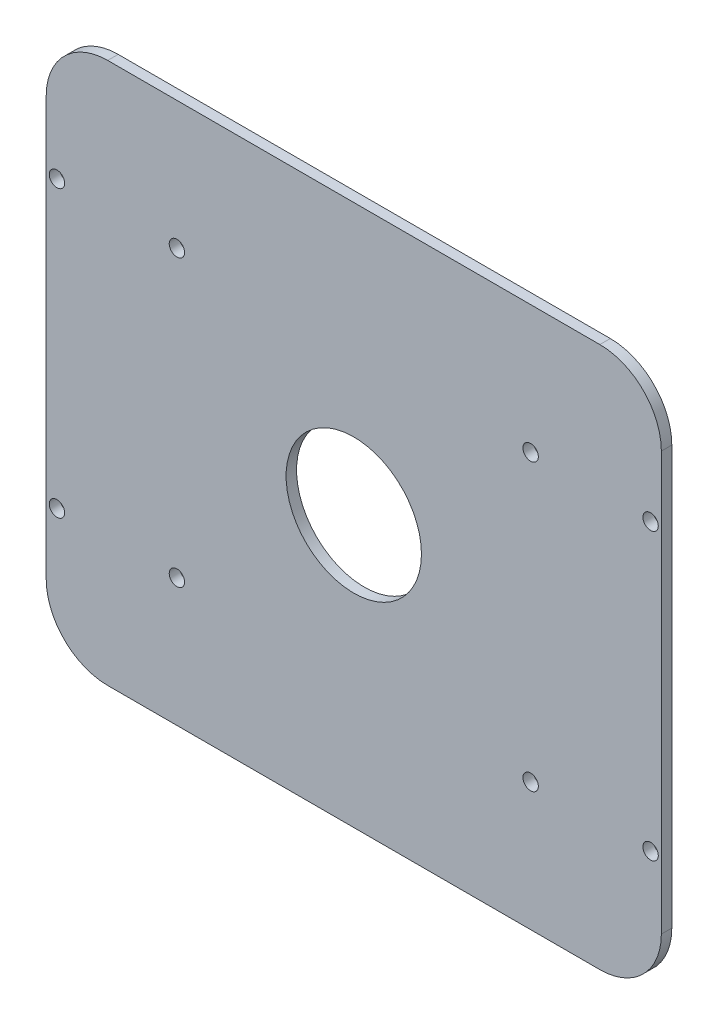
ISO-10303-21;
HEADER;
FILE_DESCRIPTION(('STEP AP214'),'2;1');
FILE_NAME('part.step','',(''),(''),'','','');
FILE_SCHEMA(('AUTOMOTIVE_DESIGN { 1 0 10303 214 1 1 1 1 }'));
ENDSEC;
DATA;
#1=APPLICATION_CONTEXT('core data for automotive mechanical design processes');
#2=APPLICATION_PROTOCOL_DEFINITION('international standard','automotive_design',2000,#1);
#3=PRODUCT_CONTEXT('',#1,'mechanical');
#4=PRODUCT('Part','Part','',(#3));
#5=PRODUCT_RELATED_PRODUCT_CATEGORY('part','',(#4));
#6=PRODUCT_DEFINITION_FORMATION('','',#4);
#7=PRODUCT_DEFINITION_CONTEXT('part definition',#1,'design');
#8=PRODUCT_DEFINITION('design','',#6,#7);
#9=PRODUCT_DEFINITION_SHAPE('','',#8);
#10=(LENGTH_UNIT() NAMED_UNIT(*) SI_UNIT(.MILLI.,.METRE.));
#11=(NAMED_UNIT(*) PLANE_ANGLE_UNIT() SI_UNIT($,.RADIAN.));
#12=(NAMED_UNIT(*) SI_UNIT($,.STERADIAN.) SOLID_ANGLE_UNIT());
#13=UNCERTAINTY_MEASURE_WITH_UNIT(LENGTH_MEASURE(1.E-05),#10,'distance_accuracy_value','');
#14=(GEOMETRIC_REPRESENTATION_CONTEXT(3) GLOBAL_UNCERTAINTY_ASSIGNED_CONTEXT((#13)) GLOBAL_UNIT_ASSIGNED_CONTEXT((#10,
#11,#12)) REPRESENTATION_CONTEXT('',''));
#15=CARTESIAN_POINT('',(0.,0.,0.));
#16=DIRECTION('',(0.,0.,1.));
#17=DIRECTION('',(1.,0.,0.));
#18=AXIS2_PLACEMENT_3D('',#15,#16,#17);
#19=CARTESIAN_POINT('',(0.,0.,1.7));
#20=DIRECTION('',(0.,0.,1.));
#21=DIRECTION('',(1.,0.,0.));
#22=AXIS2_PLACEMENT_3D('',#19,#20,#21);
#23=PLANE('',#22);
#24=CARTESIAN_POINT('',(28.75,-23.2,1.7));
#25=DIRECTION('',(0.,0.,1.));
#26=DIRECTION('',(1.,0.,0.));
#27=AXIS2_PLACEMENT_3D('',#24,#25,#26);
#28=CIRCLE('',#27,1.25);
#29=CARTESIAN_POINT('',(30.,-23.2,1.7));
#30=VERTEX_POINT('',#29);
#31=EDGE_CURVE('E280',#30,#30,#28,.T.);
#32=ORIENTED_EDGE('',*,*,#31,.F.);
#33=EDGE_LOOP('',(#32));
#34=FACE_BOUND('',#33,.T.);
#35=CARTESIAN_POINT('',(0.,0.,1.7));
#36=DIRECTION('',(0.,0.,1.));
#37=DIRECTION('',(1.,0.,0.));
#38=AXIS2_PLACEMENT_3D('',#35,#36,#37);
#39=CIRCLE('',#38,11.);
#40=CARTESIAN_POINT('',(11.,0.,1.7));
#41=VERTEX_POINT('',#40);
#42=EDGE_CURVE('E296',#41,#41,#39,.T.);
#43=ORIENTED_EDGE('',*,*,#42,.F.);
#44=EDGE_LOOP('',(#43));
#45=FACE_BOUND('',#44,.T.);
#46=CARTESIAN_POINT('',(48.25,-23.2,1.7));
#47=DIRECTION('',(0.,0.,1.));
#48=DIRECTION('',(-1.,0.,0.));
#49=AXIS2_PLACEMENT_3D('',#46,#47,#48);
#50=CIRCLE('',#49,1.25);
#51=CARTESIAN_POINT('',(47.,-23.2,1.7));
#52=VERTEX_POINT('',#51);
#53=EDGE_CURVE('E312',#52,#52,#50,.T.);
#54=ORIENTED_EDGE('',*,*,#53,.F.);
#55=EDGE_LOOP('',(#54));
#56=FACE_BOUND('',#55,.T.);
#57=CARTESIAN_POINT('',(-48.25,-23.2,1.7));
#58=DIRECTION('',(0.,0.,1.));
#59=DIRECTION('',(1.,0.,0.));
#60=AXIS2_PLACEMENT_3D('',#57,#58,#59);
#61=CIRCLE('',#60,1.25);
#62=CARTESIAN_POINT('',(-47.,-23.2,1.7));
#63=VERTEX_POINT('',#62);
#64=EDGE_CURVE('E328',#63,#63,#61,.T.);
#65=ORIENTED_EDGE('',*,*,#64,.F.);
#66=EDGE_LOOP('',(#65));
#67=FACE_BOUND('',#66,.T.);
#68=DIRECTION('',(0.,-1.,0.));
#69=VECTOR('',#68,1.);
#70=CARTESIAN_POINT('',(-50.,44.,1.7));
#71=LINE('',#70,#69);
#72=CARTESIAN_POINT('',(-50.,34.,1.7));
#73=VERTEX_POINT('',#72);
#74=CARTESIAN_POINT('',(-50.,-34.,1.7));
#75=VERTEX_POINT('',#74);
#76=EDGE_CURVE('E184',#73,#75,#71,.T.);
#77=ORIENTED_EDGE('',*,*,#76,.T.);
#78=CARTESIAN_POINT('',(-40.,-34.,1.7));
#79=DIRECTION('',(0.,0.,1.));
#80=DIRECTION('',(1.,0.,0.));
#81=AXIS2_PLACEMENT_3D('',#78,#79,#80);
#82=CIRCLE('',#81,10.);
#83=CARTESIAN_POINT('',(-40.,-44.,1.7));
#84=VERTEX_POINT('',#83);
#85=EDGE_CURVE('E172',#75,#84,#82,.T.);
#86=ORIENTED_EDGE('',*,*,#85,.T.);
#87=DIRECTION('',(1.,0.,0.));
#88=VECTOR('',#87,1.);
#89=CARTESIAN_POINT('',(-50.,-44.,1.7));
#90=LINE('',#89,#88);
#91=CARTESIAN_POINT('',(40.,-44.,1.7));
#92=VERTEX_POINT('',#91);
#93=EDGE_CURVE('E130',#84,#92,#90,.T.);
#94=ORIENTED_EDGE('',*,*,#93,.T.);
#95=CARTESIAN_POINT('',(40.,-34.,1.7));
#96=DIRECTION('',(0.,0.,1.));
#97=DIRECTION('',(1.,0.,0.));
#98=AXIS2_PLACEMENT_3D('',#95,#96,#97);
#99=CIRCLE('',#98,10.);
#100=CARTESIAN_POINT('',(50.,-34.,1.7));
#101=VERTEX_POINT('',#100);
#102=EDGE_CURVE('E169',#92,#101,#99,.T.);
#103=ORIENTED_EDGE('',*,*,#102,.T.);
#104=DIRECTION('',(0.,1.,0.));
#105=VECTOR('',#104,1.);
#106=CARTESIAN_POINT('',(50.,44.,1.7));
#107=LINE('',#106,#105);
#108=CARTESIAN_POINT('',(50.,34.,1.7));
#109=VERTEX_POINT('',#108);
#110=EDGE_CURVE('E139',#101,#109,#107,.T.);
#111=ORIENTED_EDGE('',*,*,#110,.T.);
#112=CARTESIAN_POINT('',(40.,34.,1.7));
#113=DIRECTION('',(0.,0.,1.));
#114=DIRECTION('',(1.,0.,0.));
#115=AXIS2_PLACEMENT_3D('',#112,#113,#114);
#116=CIRCLE('',#115,10.);
#117=CARTESIAN_POINT('',(40.,44.,1.7));
#118=VERTEX_POINT('',#117);
#119=EDGE_CURVE('E64',#109,#118,#116,.T.);
#120=ORIENTED_EDGE('',*,*,#119,.T.);
#121=DIRECTION('',(-1.,0.,0.));
#122=VECTOR('',#121,1.);
#123=CARTESIAN_POINT('',(-50.,44.,1.7));
#124=LINE('',#123,#122);
#125=CARTESIAN_POINT('',(-40.,44.,1.7));
#126=VERTEX_POINT('',#125);
#127=EDGE_CURVE('E144',#118,#126,#124,.T.);
#128=ORIENTED_EDGE('',*,*,#127,.T.);
#129=CARTESIAN_POINT('',(-40.,34.,1.7));
#130=DIRECTION('',(0.,0.,1.));
#131=DIRECTION('',(1.,0.,0.));
#132=AXIS2_PLACEMENT_3D('',#129,#130,#131);
#133=CIRCLE('',#132,10.);
#134=EDGE_CURVE('E164',#126,#73,#133,.T.);
#135=ORIENTED_EDGE('',*,*,#134,.T.);
#136=EDGE_LOOP('',(#77,#86,#94,#103,#111,#120,#128,#135));
#137=FACE_BOUND('',#136,.T.);
#138=CARTESIAN_POINT('',(-48.25,23.2,1.7));
#139=DIRECTION('',(0.,0.,1.));
#140=DIRECTION('',(1.,0.,0.));
#141=AXIS2_PLACEMENT_3D('',#138,#139,#140);
#142=CIRCLE('',#141,1.25);
#143=CARTESIAN_POINT('',(-47.,23.2,1.7));
#144=VERTEX_POINT('',#143);
#145=EDGE_CURVE('E196',#144,#144,#142,.T.);
#146=ORIENTED_EDGE('',*,*,#145,.F.);
#147=EDGE_LOOP('',(#146));
#148=FACE_BOUND('',#147,.T.);
#149=CARTESIAN_POINT('',(-28.75,23.2,1.7));
#150=DIRECTION('',(0.,0.,1.));
#151=DIRECTION('',(1.,0.,0.));
#152=AXIS2_PLACEMENT_3D('',#149,#150,#151);
#153=CIRCLE('',#152,1.25);
#154=CARTESIAN_POINT('',(-27.5,23.2,1.7));
#155=VERTEX_POINT('',#154);
#156=EDGE_CURVE('E320',#155,#155,#153,.T.);
#157=ORIENTED_EDGE('',*,*,#156,.F.);
#158=EDGE_LOOP('',(#157));
#159=FACE_BOUND('',#158,.T.);
#160=CARTESIAN_POINT('',(48.25,23.2,1.7));
#161=DIRECTION('',(0.,0.,1.));
#162=DIRECTION('',(-1.,0.,0.));
#163=AXIS2_PLACEMENT_3D('',#160,#161,#162);
#164=CIRCLE('',#163,1.25);
#165=CARTESIAN_POINT('',(47.,23.2,1.7));
#166=VERTEX_POINT('',#165);
#167=EDGE_CURVE('E304',#166,#166,#164,.T.);
#168=ORIENTED_EDGE('',*,*,#167,.F.);
#169=EDGE_LOOP('',(#168));
#170=FACE_BOUND('',#169,.T.);
#171=CARTESIAN_POINT('',(-28.75,-23.2,1.7));
#172=DIRECTION('',(0.,0.,1.));
#173=DIRECTION('',(-1.,0.,0.));
#174=AXIS2_PLACEMENT_3D('',#171,#172,#173);
#175=CIRCLE('',#174,1.25);
#176=CARTESIAN_POINT('',(-30.,-23.2,1.7));
#177=VERTEX_POINT('',#176);
#178=EDGE_CURVE('E288',#177,#177,#175,.T.);
#179=ORIENTED_EDGE('',*,*,#178,.F.);
#180=EDGE_LOOP('',(#179));
#181=FACE_BOUND('',#180,.T.);
#182=CARTESIAN_POINT('',(28.75,23.2,1.7));
#183=DIRECTION('',(0.,0.,1.));
#184=DIRECTION('',(-1.,0.,0.));
#185=AXIS2_PLACEMENT_3D('',#182,#183,#184);
#186=CIRCLE('',#185,1.25);
#187=CARTESIAN_POINT('',(27.5,23.2,1.7));
#188=VERTEX_POINT('',#187);
#189=EDGE_CURVE('E269',#188,#188,#186,.T.);
#190=ORIENTED_EDGE('',*,*,#189,.F.);
#191=EDGE_LOOP('',(#190));
#192=FACE_BOUND('',#191,.T.);
#193=ADVANCED_FACE('F42',(#34,#45,#56,#67,#137,#148,#159,#170,#181,#192),#23,.T.);
#194=CARTESIAN_POINT('',(0.,0.,0.));
#195=DIRECTION('',(0.,0.,1.));
#196=DIRECTION('',(1.,0.,0.));
#197=AXIS2_PLACEMENT_3D('',#194,#195,#196);
#198=PLANE('',#197);
#199=DIRECTION('',(1.,0.,0.));
#200=VECTOR('',#199,1.);
#201=CARTESIAN_POINT('',(-50.,-44.,0.));
#202=LINE('',#201,#200);
#203=CARTESIAN_POINT('',(-40.,-44.,0.));
#204=VERTEX_POINT('',#203);
#205=CARTESIAN_POINT('',(40.,-44.,0.));
#206=VERTEX_POINT('',#205);
#207=EDGE_CURVE('E127',#204,#206,#202,.T.);
#208=ORIENTED_EDGE('',*,*,#207,.F.);
#209=CARTESIAN_POINT('',(-40.,-34.,0.));
#210=DIRECTION('',(0.,0.,1.));
#211=DIRECTION('',(1.,0.,0.));
#212=AXIS2_PLACEMENT_3D('',#209,#210,#211);
#213=CIRCLE('',#212,10.);
#214=CARTESIAN_POINT('',(-50.,-34.,0.));
#215=VERTEX_POINT('',#214);
#216=EDGE_CURVE('E109',#204,#215,#213,.F.);
#217=ORIENTED_EDGE('',*,*,#216,.T.);
#218=DIRECTION('',(0.,-1.,0.));
#219=VECTOR('',#218,1.);
#220=CARTESIAN_POINT('',(-50.,44.,0.));
#221=LINE('',#220,#219);
#222=CARTESIAN_POINT('',(-50.,34.,0.));
#223=VERTEX_POINT('',#222);
#224=EDGE_CURVE('E140',#223,#215,#221,.T.);
#225=ORIENTED_EDGE('',*,*,#224,.F.);
#226=CARTESIAN_POINT('',(-40.,34.,0.));
#227=DIRECTION('',(0.,0.,1.));
#228=DIRECTION('',(1.,0.,0.));
#229=AXIS2_PLACEMENT_3D('',#226,#227,#228);
#230=CIRCLE('',#229,10.);
#231=CARTESIAN_POINT('',(-40.,44.,0.));
#232=VERTEX_POINT('',#231);
#233=EDGE_CURVE('E132',#223,#232,#230,.F.);
#234=ORIENTED_EDGE('',*,*,#233,.T.);
#235=DIRECTION('',(-1.,0.,0.));
#236=VECTOR('',#235,1.);
#237=CARTESIAN_POINT('',(-50.,44.,0.));
#238=LINE('',#237,#236);
#239=CARTESIAN_POINT('',(40.,44.,0.));
#240=VERTEX_POINT('',#239);
#241=EDGE_CURVE('E146',#240,#232,#238,.T.);
#242=ORIENTED_EDGE('',*,*,#241,.F.);
#243=CARTESIAN_POINT('',(40.,34.,0.));
#244=DIRECTION('',(0.,0.,1.));
#245=DIRECTION('',(1.,0.,0.));
#246=AXIS2_PLACEMENT_3D('',#243,#244,#245);
#247=CIRCLE('',#246,10.);
#248=CARTESIAN_POINT('',(50.,34.,0.));
#249=VERTEX_POINT('',#248);
#250=EDGE_CURVE('E154',#240,#249,#247,.F.);
#251=ORIENTED_EDGE('',*,*,#250,.T.);
#252=DIRECTION('',(0.,1.,0.));
#253=VECTOR('',#252,1.);
#254=CARTESIAN_POINT('',(50.,44.,0.));
#255=LINE('',#254,#253);
#256=CARTESIAN_POINT('',(50.,-34.,0.));
#257=VERTEX_POINT('',#256);
#258=EDGE_CURVE('E193',#257,#249,#255,.T.);
#259=ORIENTED_EDGE('',*,*,#258,.F.);
#260=CARTESIAN_POINT('',(40.,-34.,0.));
#261=DIRECTION('',(0.,0.,1.));
#262=DIRECTION('',(1.,0.,0.));
#263=AXIS2_PLACEMENT_3D('',#260,#261,#262);
#264=CIRCLE('',#263,10.);
#265=EDGE_CURVE('E121',#257,#206,#264,.F.);
#266=ORIENTED_EDGE('',*,*,#265,.T.);
#267=EDGE_LOOP('',(#208,#217,#225,#234,#242,#251,#259,#266));
#268=FACE_BOUND('',#267,.T.);
#269=CARTESIAN_POINT('',(-48.25,23.2,0.));
#270=DIRECTION('',(0.,0.,1.));
#271=DIRECTION('',(1.,0.,0.));
#272=AXIS2_PLACEMENT_3D('',#269,#270,#271);
#273=CIRCLE('',#272,1.25);
#274=CARTESIAN_POINT('',(-47.,23.2,0.));
#275=VERTEX_POINT('',#274);
#276=EDGE_CURVE('E332',#275,#275,#273,.T.);
#277=ORIENTED_EDGE('',*,*,#276,.T.);
#278=EDGE_LOOP('',(#277));
#279=FACE_BOUND('',#278,.T.);
#280=CARTESIAN_POINT('',(-48.25,-23.2,0.));
#281=DIRECTION('',(0.,0.,1.));
#282=DIRECTION('',(1.,0.,0.));
#283=AXIS2_PLACEMENT_3D('',#280,#281,#282);
#284=CIRCLE('',#283,1.25);
#285=CARTESIAN_POINT('',(-47.,-23.2,0.));
#286=VERTEX_POINT('',#285);
#287=EDGE_CURVE('E324',#286,#286,#284,.T.);
#288=ORIENTED_EDGE('',*,*,#287,.T.);
#289=EDGE_LOOP('',(#288));
#290=FACE_BOUND('',#289,.T.);
#291=CARTESIAN_POINT('',(-28.75,23.2,0.));
#292=DIRECTION('',(0.,0.,1.));
#293=DIRECTION('',(1.,0.,0.));
#294=AXIS2_PLACEMENT_3D('',#291,#292,#293);
#295=CIRCLE('',#294,1.25);
#296=CARTESIAN_POINT('',(-27.5,23.2,0.));
#297=VERTEX_POINT('',#296);
#298=EDGE_CURVE('E316',#297,#297,#295,.T.);
#299=ORIENTED_EDGE('',*,*,#298,.T.);
#300=EDGE_LOOP('',(#299));
#301=FACE_BOUND('',#300,.T.);
#302=CARTESIAN_POINT('',(48.25,-23.2,0.));
#303=DIRECTION('',(0.,0.,1.));
#304=DIRECTION('',(-1.,0.,0.));
#305=AXIS2_PLACEMENT_3D('',#302,#303,#304);
#306=CIRCLE('',#305,1.25);
#307=CARTESIAN_POINT('',(47.,-23.2,0.));
#308=VERTEX_POINT('',#307);
#309=EDGE_CURVE('E308',#308,#308,#306,.T.);
#310=ORIENTED_EDGE('',*,*,#309,.T.);
#311=EDGE_LOOP('',(#310));
#312=FACE_BOUND('',#311,.T.);
#313=CARTESIAN_POINT('',(48.25,23.2,0.));
#314=DIRECTION('',(0.,0.,1.));
#315=DIRECTION('',(-1.,0.,0.));
#316=AXIS2_PLACEMENT_3D('',#313,#314,#315);
#317=CIRCLE('',#316,1.25);
#318=CARTESIAN_POINT('',(47.,23.2,0.));
#319=VERTEX_POINT('',#318);
#320=EDGE_CURVE('E300',#319,#319,#317,.T.);
#321=ORIENTED_EDGE('',*,*,#320,.T.);
#322=EDGE_LOOP('',(#321));
#323=FACE_BOUND('',#322,.T.);
#324=CARTESIAN_POINT('',(0.,0.,0.));
#325=DIRECTION('',(0.,0.,1.));
#326=DIRECTION('',(1.,0.,0.));
#327=AXIS2_PLACEMENT_3D('',#324,#325,#326);
#328=CIRCLE('',#327,11.);
#329=CARTESIAN_POINT('',(11.,0.,0.));
#330=VERTEX_POINT('',#329);
#331=EDGE_CURVE('E292',#330,#330,#328,.T.);
#332=ORIENTED_EDGE('',*,*,#331,.T.);
#333=EDGE_LOOP('',(#332));
#334=FACE_BOUND('',#333,.T.);
#335=CARTESIAN_POINT('',(-28.75,-23.2,0.));
#336=DIRECTION('',(0.,0.,1.));
#337=DIRECTION('',(-1.,0.,0.));
#338=AXIS2_PLACEMENT_3D('',#335,#336,#337);
#339=CIRCLE('',#338,1.25);
#340=CARTESIAN_POINT('',(-30.,-23.2,0.));
#341=VERTEX_POINT('',#340);
#342=EDGE_CURVE('E284',#341,#341,#339,.T.);
#343=ORIENTED_EDGE('',*,*,#342,.T.);
#344=EDGE_LOOP('',(#343));
#345=FACE_BOUND('',#344,.T.);
#346=CARTESIAN_POINT('',(28.75,-23.2,0.));
#347=DIRECTION('',(0.,0.,1.));
#348=DIRECTION('',(1.,0.,0.));
#349=AXIS2_PLACEMENT_3D('',#346,#347,#348);
#350=CIRCLE('',#349,1.25);
#351=CARTESIAN_POINT('',(30.,-23.2,0.));
#352=VERTEX_POINT('',#351);
#353=EDGE_CURVE('E277',#352,#352,#350,.T.);
#354=ORIENTED_EDGE('',*,*,#353,.T.);
#355=EDGE_LOOP('',(#354));
#356=FACE_BOUND('',#355,.T.);
#357=CARTESIAN_POINT('',(28.75,23.2,0.));
#358=DIRECTION('',(0.,0.,1.));
#359=DIRECTION('',(-1.,0.,0.));
#360=AXIS2_PLACEMENT_3D('',#357,#358,#359);
#361=CIRCLE('',#360,1.25);
#362=CARTESIAN_POINT('',(27.5,23.2,0.));
#363=VERTEX_POINT('',#362);
#364=EDGE_CURVE('E272',#363,#363,#361,.T.);
#365=ORIENTED_EDGE('',*,*,#364,.T.);
#366=EDGE_LOOP('',(#365));
#367=FACE_BOUND('',#366,.T.);
#368=ADVANCED_FACE('F135',(#268,#279,#290,#301,#312,#323,#334,#345,#356,#367),#198,.F.);
#369=CARTESIAN_POINT('',(50.,44.,1.7));
#370=DIRECTION('',(-1.,0.,0.));
#371=DIRECTION('',(0.,0.,1.));
#372=AXIS2_PLACEMENT_3D('',#369,#370,#371);
#373=PLANE('',#372);
#374=ORIENTED_EDGE('',*,*,#110,.F.);
#375=DIRECTION('',(0.,0.,-1.));
#376=VECTOR('',#375,1.);
#377=CARTESIAN_POINT('',(50.,-34.,1.7));
#378=LINE('',#377,#376);
#379=EDGE_CURVE('E178',#101,#257,#378,.T.);
#380=ORIENTED_EDGE('',*,*,#379,.T.);
#381=ORIENTED_EDGE('',*,*,#258,.T.);
#382=DIRECTION('',(0.,0.,-1.));
#383=VECTOR('',#382,1.);
#384=CARTESIAN_POINT('',(50.,34.,1.7));
#385=LINE('',#384,#383);
#386=EDGE_CURVE('E175',#249,#109,#385,.F.);
#387=ORIENTED_EDGE('',*,*,#386,.T.);
#388=EDGE_LOOP('',(#374,#380,#381,#387));
#389=FACE_BOUND('',#388,.T.);
#390=ADVANCED_FACE('F215',(#389),#373,.F.);
#391=CARTESIAN_POINT('',(-50.,44.,1.7));
#392=DIRECTION('',(0.,-1.,0.));
#393=DIRECTION('',(0.,0.,-1.));
#394=AXIS2_PLACEMENT_3D('',#391,#392,#393);
#395=PLANE('',#394);
#396=ORIENTED_EDGE('',*,*,#127,.F.);
#397=DIRECTION('',(0.,0.,-1.));
#398=VECTOR('',#397,1.);
#399=CARTESIAN_POINT('',(40.,44.,1.7));
#400=LINE('',#399,#398);
#401=EDGE_CURVE('E11',#118,#240,#400,.T.);
#402=ORIENTED_EDGE('',*,*,#401,.T.);
#403=ORIENTED_EDGE('',*,*,#241,.T.);
#404=DIRECTION('',(0.,0.,-1.));
#405=VECTOR('',#404,1.);
#406=CARTESIAN_POINT('',(-40.,44.,1.7));
#407=LINE('',#406,#405);
#408=EDGE_CURVE('E51',#232,#126,#407,.F.);
#409=ORIENTED_EDGE('',*,*,#408,.T.);
#410=EDGE_LOOP('',(#396,#402,#403,#409));
#411=FACE_BOUND('',#410,.T.);
#412=ADVANCED_FACE('F199',(#411),#395,.F.);
#413=CARTESIAN_POINT('',(-50.,44.,1.7));
#414=DIRECTION('',(1.,0.,0.));
#415=DIRECTION('',(0.,0.,-1.));
#416=AXIS2_PLACEMENT_3D('',#413,#414,#415);
#417=PLANE('',#416);
#418=ORIENTED_EDGE('',*,*,#224,.T.);
#419=DIRECTION('',(0.,0.,-1.));
#420=VECTOR('',#419,1.);
#421=CARTESIAN_POINT('',(-50.,-34.,1.7));
#422=LINE('',#421,#420);
#423=EDGE_CURVE('E114',#215,#75,#422,.F.);
#424=ORIENTED_EDGE('',*,*,#423,.T.);
#425=ORIENTED_EDGE('',*,*,#76,.F.);
#426=DIRECTION('',(0.,0.,-1.));
#427=VECTOR('',#426,1.);
#428=CARTESIAN_POINT('',(-50.,34.,1.7));
#429=LINE('',#428,#427);
#430=EDGE_CURVE('E120',#73,#223,#429,.T.);
#431=ORIENTED_EDGE('',*,*,#430,.T.);
#432=EDGE_LOOP('',(#418,#424,#425,#431));
#433=FACE_BOUND('',#432,.T.);
#434=ADVANCED_FACE('F206',(#433),#417,.F.);
#435=CARTESIAN_POINT('',(-50.,-44.,1.7));
#436=DIRECTION('',(0.,1.,0.));
#437=DIRECTION('',(0.,0.,1.));
#438=AXIS2_PLACEMENT_3D('',#435,#436,#437);
#439=PLANE('',#438);
#440=ORIENTED_EDGE('',*,*,#93,.F.);
#441=DIRECTION('',(0.,0.,-1.));
#442=VECTOR('',#441,1.);
#443=CARTESIAN_POINT('',(-40.,-44.,1.7));
#444=LINE('',#443,#442);
#445=EDGE_CURVE('E113',#84,#204,#444,.T.);
#446=ORIENTED_EDGE('',*,*,#445,.T.);
#447=ORIENTED_EDGE('',*,*,#207,.T.);
#448=DIRECTION('',(0.,0.,-1.));
#449=VECTOR('',#448,1.);
#450=CARTESIAN_POINT('',(40.,-44.,1.7));
#451=LINE('',#450,#449);
#452=EDGE_CURVE('E133',#206,#92,#451,.F.);
#453=ORIENTED_EDGE('',*,*,#452,.T.);
#454=EDGE_LOOP('',(#440,#446,#447,#453));
#455=FACE_BOUND('',#454,.T.);
#456=ADVANCED_FACE('F126',(#455),#439,.F.);
#457=CARTESIAN_POINT('',(-48.25,23.2,1.7));
#458=DIRECTION('',(0.,0.,-1.));
#459=DIRECTION('',(-1.,0.,0.));
#460=AXIS2_PLACEMENT_3D('',#457,#458,#459);
#461=CYLINDRICAL_SURFACE('',#460,1.25);
#462=ORIENTED_EDGE('',*,*,#145,.T.);
#463=EDGE_LOOP('',(#462));
#464=FACE_BOUND('',#463,.T.);
#465=ORIENTED_EDGE('',*,*,#276,.F.);
#466=EDGE_LOOP('',(#465));
#467=FACE_BOUND('',#466,.T.);
#468=ADVANCED_FACE('F213',(#464,#467),#461,.F.);
#469=CARTESIAN_POINT('',(-48.25,-23.2,1.7));
#470=DIRECTION('',(0.,0.,-1.));
#471=DIRECTION('',(-1.,0.,0.));
#472=AXIS2_PLACEMENT_3D('',#469,#470,#471);
#473=CYLINDRICAL_SURFACE('',#472,1.25);
#474=ORIENTED_EDGE('',*,*,#64,.T.);
#475=EDGE_LOOP('',(#474));
#476=FACE_BOUND('',#475,.T.);
#477=ORIENTED_EDGE('',*,*,#287,.F.);
#478=EDGE_LOOP('',(#477));
#479=FACE_BOUND('',#478,.T.);
#480=ADVANCED_FACE('F229',(#476,#479),#473,.F.);
#481=CARTESIAN_POINT('',(-28.75,23.2,1.7));
#482=DIRECTION('',(0.,0.,-1.));
#483=DIRECTION('',(-1.,0.,0.));
#484=AXIS2_PLACEMENT_3D('',#481,#482,#483);
#485=CYLINDRICAL_SURFACE('',#484,1.25);
#486=ORIENTED_EDGE('',*,*,#156,.T.);
#487=EDGE_LOOP('',(#486));
#488=FACE_BOUND('',#487,.T.);
#489=ORIENTED_EDGE('',*,*,#298,.F.);
#490=EDGE_LOOP('',(#489));
#491=FACE_BOUND('',#490,.T.);
#492=ADVANCED_FACE('F233',(#488,#491),#485,.F.);
#493=CARTESIAN_POINT('',(48.25,-23.2,1.7));
#494=DIRECTION('',(0.,0.,-1.));
#495=DIRECTION('',(-1.,0.,0.));
#496=AXIS2_PLACEMENT_3D('',#493,#494,#495);
#497=CYLINDRICAL_SURFACE('',#496,1.25);
#498=ORIENTED_EDGE('',*,*,#53,.T.);
#499=EDGE_LOOP('',(#498));
#500=FACE_BOUND('',#499,.T.);
#501=ORIENTED_EDGE('',*,*,#309,.F.);
#502=EDGE_LOOP('',(#501));
#503=FACE_BOUND('',#502,.T.);
#504=ADVANCED_FACE('F237',(#500,#503),#497,.F.);
#505=CARTESIAN_POINT('',(48.25,23.2,1.7));
#506=DIRECTION('',(0.,0.,-1.));
#507=DIRECTION('',(-1.,0.,0.));
#508=AXIS2_PLACEMENT_3D('',#505,#506,#507);
#509=CYLINDRICAL_SURFACE('',#508,1.25);
#510=ORIENTED_EDGE('',*,*,#167,.T.);
#511=EDGE_LOOP('',(#510));
#512=FACE_BOUND('',#511,.T.);
#513=ORIENTED_EDGE('',*,*,#320,.F.);
#514=EDGE_LOOP('',(#513));
#515=FACE_BOUND('',#514,.T.);
#516=ADVANCED_FACE('F241',(#512,#515),#509,.F.);
#517=CARTESIAN_POINT('',(0.,0.,1.7));
#518=DIRECTION('',(0.,0.,-1.));
#519=DIRECTION('',(-1.,0.,0.));
#520=AXIS2_PLACEMENT_3D('',#517,#518,#519);
#521=CYLINDRICAL_SURFACE('',#520,11.);
#522=ORIENTED_EDGE('',*,*,#42,.T.);
#523=EDGE_LOOP('',(#522));
#524=FACE_BOUND('',#523,.T.);
#525=ORIENTED_EDGE('',*,*,#331,.F.);
#526=EDGE_LOOP('',(#525));
#527=FACE_BOUND('',#526,.T.);
#528=ADVANCED_FACE('F245',(#524,#527),#521,.F.);
#529=CARTESIAN_POINT('',(-28.75,-23.2,1.7));
#530=DIRECTION('',(0.,0.,-1.));
#531=DIRECTION('',(-1.,0.,0.));
#532=AXIS2_PLACEMENT_3D('',#529,#530,#531);
#533=CYLINDRICAL_SURFACE('',#532,1.25);
#534=ORIENTED_EDGE('',*,*,#178,.T.);
#535=EDGE_LOOP('',(#534));
#536=FACE_BOUND('',#535,.T.);
#537=ORIENTED_EDGE('',*,*,#342,.F.);
#538=EDGE_LOOP('',(#537));
#539=FACE_BOUND('',#538,.T.);
#540=ADVANCED_FACE('F249',(#536,#539),#533,.F.);
#541=CARTESIAN_POINT('',(28.75,-23.2,1.7));
#542=DIRECTION('',(0.,0.,-1.));
#543=DIRECTION('',(-1.,0.,0.));
#544=AXIS2_PLACEMENT_3D('',#541,#542,#543);
#545=CYLINDRICAL_SURFACE('',#544,1.25);
#546=ORIENTED_EDGE('',*,*,#31,.T.);
#547=EDGE_LOOP('',(#546));
#548=FACE_BOUND('',#547,.T.);
#549=ORIENTED_EDGE('',*,*,#353,.F.);
#550=EDGE_LOOP('',(#549));
#551=FACE_BOUND('',#550,.T.);
#552=ADVANCED_FACE('F253',(#548,#551),#545,.F.);
#553=CARTESIAN_POINT('',(28.75,23.2,1.7));
#554=DIRECTION('',(0.,0.,-1.));
#555=DIRECTION('',(-1.,0.,0.));
#556=AXIS2_PLACEMENT_3D('',#553,#554,#555);
#557=CYLINDRICAL_SURFACE('',#556,1.25);
#558=ORIENTED_EDGE('',*,*,#189,.T.);
#559=EDGE_LOOP('',(#558));
#560=FACE_BOUND('',#559,.T.);
#561=ORIENTED_EDGE('',*,*,#364,.F.);
#562=EDGE_LOOP('',(#561));
#563=FACE_BOUND('',#562,.T.);
#564=ADVANCED_FACE('F257',(#560,#563),#557,.F.);
#565=CARTESIAN_POINT('',(-40.,-34.,1.7));
#566=DIRECTION('',(0.,0.,-1.));
#567=DIRECTION('',(-1.,0.,0.));
#568=AXIS2_PLACEMENT_3D('',#565,#566,#567);
#569=CYLINDRICAL_SURFACE('',#568,10.);
#570=ORIENTED_EDGE('',*,*,#85,.F.);
#571=ORIENTED_EDGE('',*,*,#423,.F.);
#572=ORIENTED_EDGE('',*,*,#216,.F.);
#573=ORIENTED_EDGE('',*,*,#445,.F.);
#574=EDGE_LOOP('',(#570,#571,#572,#573));
#575=FACE_BOUND('',#574,.T.);
#576=ADVANCED_FACE('F112',(#575),#569,.T.);
#577=CARTESIAN_POINT('',(40.,-34.,1.7));
#578=DIRECTION('',(0.,0.,-1.));
#579=DIRECTION('',(-1.,0.,0.));
#580=AXIS2_PLACEMENT_3D('',#577,#578,#579);
#581=CYLINDRICAL_SURFACE('',#580,10.);
#582=ORIENTED_EDGE('',*,*,#102,.F.);
#583=ORIENTED_EDGE('',*,*,#452,.F.);
#584=ORIENTED_EDGE('',*,*,#265,.F.);
#585=ORIENTED_EDGE('',*,*,#379,.F.);
#586=EDGE_LOOP('',(#582,#583,#584,#585));
#587=FACE_BOUND('',#586,.T.);
#588=ADVANCED_FACE('F264',(#587),#581,.T.);
#589=CARTESIAN_POINT('',(40.,34.,1.7));
#590=DIRECTION('',(0.,0.,-1.));
#591=DIRECTION('',(-1.,0.,0.));
#592=AXIS2_PLACEMENT_3D('',#589,#590,#591);
#593=CYLINDRICAL_SURFACE('',#592,10.);
#594=ORIENTED_EDGE('',*,*,#119,.F.);
#595=ORIENTED_EDGE('',*,*,#386,.F.);
#596=ORIENTED_EDGE('',*,*,#250,.F.);
#597=ORIENTED_EDGE('',*,*,#401,.F.);
#598=EDGE_LOOP('',(#594,#595,#596,#597));
#599=FACE_BOUND('',#598,.T.);
#600=ADVANCED_FACE('F379',(#599),#593,.T.);
#601=CARTESIAN_POINT('',(-40.,34.,1.7));
#602=DIRECTION('',(0.,0.,-1.));
#603=DIRECTION('',(-1.,0.,0.));
#604=AXIS2_PLACEMENT_3D('',#601,#602,#603);
#605=CYLINDRICAL_SURFACE('',#604,10.);
#606=ORIENTED_EDGE('',*,*,#134,.F.);
#607=ORIENTED_EDGE('',*,*,#408,.F.);
#608=ORIENTED_EDGE('',*,*,#233,.F.);
#609=ORIENTED_EDGE('',*,*,#430,.F.);
#610=EDGE_LOOP('',(#606,#607,#608,#609));
#611=FACE_BOUND('',#610,.T.);
#612=ADVANCED_FACE('F44',(#611),#605,.T.);
#613=CLOSED_SHELL('',(#193,#368,#390,#412,#434,#456,#468,#480,#492,#504,#516,#528,#540,#552,
#564,#576,#588,#600,#612));
#614=MANIFOLD_SOLID_BREP('B2',#613);
#615=ADVANCED_BREP_SHAPE_REPRESENTATION('',(#18,#614),#14);
#616=SHAPE_DEFINITION_REPRESENTATION(#9,#615);
ENDSEC;
END-ISO-10303-21;
